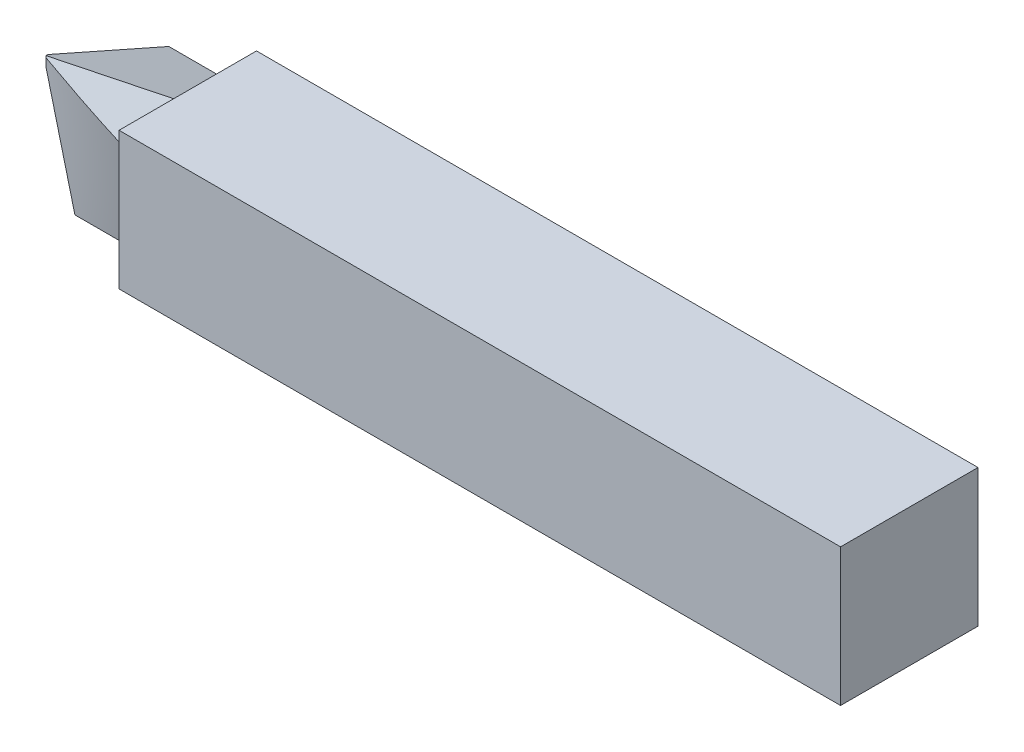
ISO-10303-21;
HEADER;
FILE_DESCRIPTION(('STEP AP214'),'2;1');
FILE_NAME('part.step','',(''),(''),'','','');
FILE_SCHEMA(('AUTOMOTIVE_DESIGN { 1 0 10303 214 1 1 1 1 }'));
ENDSEC;
DATA;
#1=APPLICATION_CONTEXT('core data for automotive mechanical design processes');
#2=APPLICATION_PROTOCOL_DEFINITION('international standard','automotive_design',2000,#1);
#3=PRODUCT_CONTEXT('',#1,'mechanical');
#4=PRODUCT('Part','Part','',(#3));
#5=PRODUCT_RELATED_PRODUCT_CATEGORY('part','',(#4));
#6=PRODUCT_DEFINITION_FORMATION('','',#4);
#7=PRODUCT_DEFINITION_CONTEXT('part definition',#1,'design');
#8=PRODUCT_DEFINITION('design','',#6,#7);
#9=PRODUCT_DEFINITION_SHAPE('','',#8);
#10=(LENGTH_UNIT() NAMED_UNIT(*) SI_UNIT(.MILLI.,.METRE.));
#11=(NAMED_UNIT(*) PLANE_ANGLE_UNIT() SI_UNIT($,.RADIAN.));
#12=(NAMED_UNIT(*) SI_UNIT($,.STERADIAN.) SOLID_ANGLE_UNIT());
#13=UNCERTAINTY_MEASURE_WITH_UNIT(LENGTH_MEASURE(1.E-05),#10,'distance_accuracy_value','');
#14=(GEOMETRIC_REPRESENTATION_CONTEXT(3) GLOBAL_UNCERTAINTY_ASSIGNED_CONTEXT((#13)) GLOBAL_UNIT_ASSIGNED_CONTEXT((#10,
#11,#12)) REPRESENTATION_CONTEXT('',''));
#15=CARTESIAN_POINT('',(0.,0.,0.));
#16=DIRECTION('',(0.,0.,1.));
#17=DIRECTION('',(1.,0.,0.));
#18=AXIS2_PLACEMENT_3D('',#15,#16,#17);
#19=CARTESIAN_POINT('',(15.,10.,10.));
#20=CARTESIAN_POINT('',(15.,-10.,3.87867740821987));
#21=CARTESIAN_POINT('',(12.5,10.,9.3301270189222));
#22=CARTESIAN_POINT('',(12.9092818696764,-10.,3.87867740821987));
#23=CARTESIAN_POINT('',(10.,10.,8.66025403784439));
#24=CARTESIAN_POINT('',(10.8185637393527,-10.,3.87867740821987));
#25=CARTESIAN_POINT('',(5.,10.,7.32050807568877));
#26=CARTESIAN_POINT('',(6.63712747870541,-10.,3.87867740821987));
#27=CARTESIAN_POINT('',(2.5,10.,6.65063509461096));
#28=CARTESIAN_POINT('',(4.54640934838176,-10.,3.87867740821987));
#29=CARTESIAN_POINT('',(0.,10.,5.98076211353315));
#30=CARTESIAN_POINT('',(2.45569121805811,-10.,3.87867740821987));
#31=(BOUNDED_SURFACE() B_SPLINE_SURFACE(3,1,((#19,#20),(#21,#22),(#23,#24),(#25,#26),(#27,#28),
(#29,#30)),.UNSPECIFIED.,.F.,.F.,.F.) B_SPLINE_SURFACE_WITH_KNOTS((4,2,4),(2,2),(0.,0.5,1.),(0.,
1.),.UNSPECIFIED.) GEOMETRIC_REPRESENTATION_ITEM() RATIONAL_B_SPLINE_SURFACE(((1.,1.),(1.,1.),
(1.,1.),(1.,1.),(1.,1.),(1.,1.))) REPRESENTATION_ITEM('') SURFACE());
#32=CARTESIAN_POINT('',(0.546298910514148,9.90367276254304,6.11327160630295));
#33=CARTESIAN_POINT('',(0.540506221738827,9.89520023405755,6.11050677704795));
#34=CARTESIAN_POINT('',(0.534977257830135,9.88654060330857,6.10778735300682));
#35=CARTESIAN_POINT('',(0.523969618314375,9.86825513874478,6.1022269158562));
#36=CARTESIAN_POINT('',(0.518526539916392,9.85860582885153,6.09939231698987));
#37=CARTESIAN_POINT('',(0.507689279109137,9.83834384015307,6.09360224445215));
#38=CARTESIAN_POINT('',(0.502327588833297,9.82771221259882,6.09065302352847));
#39=CARTESIAN_POINT('',(0.491657617956346,9.80547970552115,6.08463475210115));
#40=CARTESIAN_POINT('',(0.48637916802469,9.79386295728239,6.08157169904691));
#41=CARTESIAN_POINT('',(0.475878210634145,9.76965787623292,6.07532680193742));
#42=CARTESIAN_POINT('',(0.470682855824234,9.75705637329503,6.07215063809136));
#43=CARTESIAN_POINT('',(0.460352048995231,9.73087896891195,6.06568088071538));
#44=CARTESIAN_POINT('',(0.455241373776108,9.71729202645838,6.06239264702499));
#45=CARTESIAN_POINT('',(0.439547346996423,9.67381904284576,6.05205539433316));
#46=CARTESIAN_POINT('',(0.429637317166674,9.64365436704081,6.04515627691639));
#47=CARTESIAN_POINT('',(0.410001681387792,9.57944572745864,6.03088353945157));
#48=CARTESIAN_POINT('',(0.400424405391126,9.54534972967789,6.02354482040574));
#49=CARTESIAN_POINT('',(0.381485915403176,9.47325698648098,6.00840418134935));
#50=CARTESIAN_POINT('',(0.372249411332458,9.43522140457306,6.00063281579612));
#51=CARTESIAN_POINT('',(0.354017684491827,9.35523885561779,5.98463814008822));
#52=CARTESIAN_POINT('',(0.345128218982267,9.31326270954695,5.97644176306692));
#53=CARTESIAN_POINT('',(0.327610086635228,9.22539082503619,5.95960730079471));
#54=CARTESIAN_POINT('',(0.319071858244164,9.17947267103265,5.95099307856208));
#55=CARTESIAN_POINT('',(0.300561181596276,9.07389420204966,5.93152513586861));
#56=CARTESIAN_POINT('',(0.290905139339313,9.01416288155193,5.92075762622618));
#57=CARTESIAN_POINT('',(0.272106082252559,8.8895583591584,5.89870945961649));
#58=CARTESIAN_POINT('',(0.263069534579339,8.82466398606295,5.88745880995129));
#59=CARTESIAN_POINT('',(0.245524808490058,8.68972902338264,5.86445711274811));
#60=CARTESIAN_POINT('',(0.237108920326707,8.61967200019927,5.85273297998857));
#61=CARTESIAN_POINT('',(0.220841210529613,8.47440250212496,5.82880207806137));
#62=CARTESIAN_POINT('',(0.213071686717167,8.39917667023158,5.81662002525124));
#63=CARTESIAN_POINT('',(0.205801296673084,8.32388294456804,5.80459511220624));
#64=B_SPLINE_CURVE_WITH_KNOTS('',3,(#32,#33,#34,#35,#36,#37,#38,#39,#40,#41,#42,#43,#44,#45,#46,
#47,#48,#49,#50,#51,#52,#53,#54,#55,#56,#57,#58,#59,#60,#61,#62,#63),.UNSPECIFIED.,.F.,.F.,(4,2,
2,2,2,2,2,2,2,2,2,2,2,2,2,4),(0.,0.0318737869042198,0.0661642496335966,0.102954522325853,
0.142311852305628,0.184291106240641,0.228937442523981,0.326367758033971,0.434845776363802,
0.554539092720379,0.685571822061818,0.828038035653471,1.01239155374652,1.21181555159331,
1.42638938563942,1.65617655745565),.UNSPECIFIED.);
#65=CARTESIAN_POINT('',(0.205801296673087,8.32388294456803,5.80459511220634));
#66=VERTEX_POINT('',#65);
#67=CARTESIAN_POINT('',(0.546298910514158,9.90367276254304,6.11327160630295));
#68=VERTEX_POINT('',#67);
#69=EDGE_CURVE('E126',#66,#68,#64,.F.);
#70=DIRECTION('',(0.121211565739221,-0.98718898245743,-0.103757743063883));
#71=VECTOR('',#70,1.);
#72=CARTESIAN_POINT('',(2.65523533984181,-11.6251564554725,3.70786658178036));
#73=LINE('',#72,#71);
#74=CARTESIAN_POINT('',(2.45569121805811,-10.,3.87867740821986));
#75=VERTEX_POINT('',#74);
#76=EDGE_CURVE('E171',#66,#75,#73,.T.);
#77=DIRECTION('',(-1.,0.,0.));
#78=VECTOR('',#77,1.);
#79=CARTESIAN_POINT('',(120.,-10.,3.87867740821987));
#80=LINE('',#79,#78);
#81=CARTESIAN_POINT('',(15.,-10.,3.87867740821987));
#82=VERTEX_POINT('',#81);
#83=EDGE_CURVE('E173',#82,#75,#80,.T.);
#84=DIRECTION('',(0.,-0.956215027462806,-0.292665032510387));
#85=VECTOR('',#84,1.);
#86=CARTESIAN_POINT('',(15.,10.,10.));
#87=LINE('',#86,#85);
#88=CARTESIAN_POINT('',(15.,7.35509528937314,9.19048425208671));
#89=VERTEX_POINT('',#88);
#90=EDGE_CURVE('E10',#89,#82,#87,.T.);
#91=CARTESIAN_POINT('',(0.546298910514158,9.90367276254304,6.11327160630295));
#92=CARTESIAN_POINT('',(5.33603524302105,9.05911301664418,7.26999784262565));
#93=CARTESIAN_POINT('',(10.1551565179942,8.20937191256027,8.30052595856325));
#94=CARTESIAN_POINT('',(15.,7.35509528937314,9.19048425208671));
#95=(BOUNDED_CURVE() B_SPLINE_CURVE(3,(#91,#92,#93,#94),.UNSPECIFIED.,.F.,
.F.) B_SPLINE_CURVE_WITH_KNOTS((4,4),(0.000570287711359436,0.0155671268516791),
.UNSPECIFIED.) CURVE() GEOMETRIC_REPRESENTATION_ITEM() RATIONAL_B_SPLINE_CURVE((1.,1.,1.,1.)) REPRESENTATION_ITEM(''));
#96=EDGE_CURVE('E143',#68,#89,#95,.T.);
#97=ORIENTED_EDGE('',*,*,#69,.F.);
#98=ORIENTED_EDGE('',*,*,#76,.T.);
#99=ORIENTED_EDGE('',*,*,#83,.F.);
#100=ORIENTED_EDGE('',*,*,#90,.F.);
#101=ORIENTED_EDGE('',*,*,#96,.F.);
#102=EDGE_LOOP('',(#97,#98,#99,#100,#101));
#103=FACE_BOUND('',#102,.T.);
#104=ADVANCED_FACE('F16',(#103),#31,.T.);
#105=CARTESIAN_POINT('',(15.,6.90804232406403,-2.51432178301037));
#106=DIRECTION('',(0.,-0.939692620785911,0.342020143325663));
#107=DIRECTION('',(-1.,0.,0.));
#108=AXIS2_PLACEMENT_3D('',#105,#106,#107);
#109=PLANE('',#108);
#110=CARTESIAN_POINT('',(0.0985039668527643,9.74489612241542,5.27986997025431));
#111=CARTESIAN_POINT('',(0.069217770176215,9.82074101039906,5.48825208737043));
#112=CARTESIAN_POINT('',(0.120283898787417,9.89504180394619,5.69239183988873));
#113=CARTESIAN_POINT('',(0.244235743587721,9.95693464875209,5.86244103341864));
#114=(BOUNDED_CURVE() B_SPLINE_CURVE(3,(#110,#111,#112,#113),.UNSPECIFIED.,.F.,
.F.) B_SPLINE_CURVE_WITH_KNOTS((4,4),(4.57276264022514,5.34226024087535),
.UNSPECIFIED.) CURVE() GEOMETRIC_REPRESENTATION_ITEM() RATIONAL_B_SPLINE_CURVE((1.,
0.95126182917611,0.95126182917611,1.)) REPRESENTATION_ITEM(''));
#115=CARTESIAN_POINT('',(0.0985039668527643,9.74489612241542,5.27986997025431));
#116=VERTEX_POINT('',#115);
#117=CARTESIAN_POINT('',(0.244235743587721,9.95693464875209,5.86244103341864));
#118=VERTEX_POINT('',#117);
#119=EDGE_CURVE('E138',#116,#118,#114,.T.);
#120=ORIENTED_EDGE('',*,*,#119,.T.);
#121=DIRECTION('',(0.888831911434334,-0.156725047300544,-0.430598528521209));
#122=VECTOR('',#121,1.);
#123=CARTESIAN_POINT('',(9.04025358617476,8.405959380311,1.60117150524408));
#124=LINE('',#123,#122);
#125=CARTESIAN_POINT('',(15.,7.35509528937314,-1.28605385552347));
#126=VERTEX_POINT('',#125);
#127=EDGE_CURVE('E155',#118,#126,#124,.T.);
#128=ORIENTED_EDGE('',*,*,#127,.T.);
#129=DIRECTION('',(0.,-0.342020143325663,-0.939692620785911));
#130=VECTOR('',#129,1.);
#131=CARTESIAN_POINT('',(15.,4.183478269785,-10.));
#132=LINE('',#131,#130);
#133=CARTESIAN_POINT('',(15.,4.183478269785,-10.));
#134=VERTEX_POINT('',#133);
#135=EDGE_CURVE('E29',#126,#134,#132,.T.);
#136=ORIENTED_EDGE('',*,*,#135,.T.);
#137=DIRECTION('',(-1.,0.,0.));
#138=VECTOR('',#137,1.);
#139=CARTESIAN_POINT('',(15.,4.18347826978496,-10.));
#140=LINE('',#139,#138);
#141=CARTESIAN_POINT('',(2.2459496466162,4.18347826978497,-10.));
#142=VERTEX_POINT('',#141);
#143=EDGE_CURVE('E260',#134,#142,#140,.T.);
#144=ORIENTED_EDGE('',*,*,#143,.T.);
#145=DIRECTION('',(-0.130928346226655,0.339075977093174,0.931603590543028));
#146=VECTOR('',#145,1.);
#147=CARTESIAN_POINT('',(6.05685222697823,-5.68593162718414,-37.1159808352652));
#148=LINE('',#147,#146);
#149=EDGE_CURVE('E306',#142,#116,#148,.T.);
#150=ORIENTED_EDGE('',*,*,#149,.T.);
#151=EDGE_LOOP('',(#120,#128,#136,#144,#150));
#152=FACE_BOUND('',#151,.T.);
#153=ADVANCED_FACE('F200',(#152),#109,.F.);
#154=CARTESIAN_POINT('',(15.,0.,-110.));
#155=DIRECTION('',(-1.,0.,0.));
#156=DIRECTION('',(0.,0.,1.));
#157=AXIS2_PLACEMENT_3D('',#154,#155,#156);
#158=PLANE('',#157);
#159=DIRECTION('',(0.,-1.,0.));
#160=VECTOR('',#159,1.);
#161=CARTESIAN_POINT('',(15.,-10.,-10.));
#162=LINE('',#161,#160);
#163=CARTESIAN_POINT('',(15.,10.,-10.));
#164=VERTEX_POINT('',#163);
#165=EDGE_CURVE('E255',#164,#134,#162,.T.);
#166=ORIENTED_EDGE('',*,*,#165,.T.);
#167=ORIENTED_EDGE('',*,*,#135,.F.);
#168=DIRECTION('',(0.,0.,1.));
#169=VECTOR('',#168,1.);
#170=CARTESIAN_POINT('',(15.,7.35509528937314,-14.));
#171=LINE('',#170,#169);
#172=EDGE_CURVE('E146',#126,#89,#171,.T.);
#173=ORIENTED_EDGE('',*,*,#172,.T.);
#174=ORIENTED_EDGE('',*,*,#90,.T.);
#175=DIRECTION('',(0.,0.,-1.));
#176=VECTOR('',#175,1.);
#177=CARTESIAN_POINT('',(15.,-10.,5.98076211353327));
#178=LINE('',#177,#176);
#179=CARTESIAN_POINT('',(15.,-10.,10.));
#180=VERTEX_POINT('',#179);
#181=EDGE_CURVE('E273',#180,#82,#178,.T.);
#182=ORIENTED_EDGE('',*,*,#181,.F.);
#183=DIRECTION('',(0.,1.,0.));
#184=VECTOR('',#183,1.);
#185=CARTESIAN_POINT('',(15.,-110.,10.));
#186=LINE('',#185,#184);
#187=CARTESIAN_POINT('',(15.,10.,10.));
#188=VERTEX_POINT('',#187);
#189=EDGE_CURVE('E307',#180,#188,#186,.T.);
#190=ORIENTED_EDGE('',*,*,#189,.T.);
#191=DIRECTION('',(0.,0.,1.));
#192=VECTOR('',#191,1.);
#193=CARTESIAN_POINT('',(15.,10.,-14.));
#194=LINE('',#193,#192);
#195=EDGE_CURVE('E55',#164,#188,#194,.T.);
#196=ORIENTED_EDGE('',*,*,#195,.F.);
#197=EDGE_LOOP('',(#166,#167,#173,#174,#182,#190,#196));
#198=FACE_BOUND('',#197,.T.);
#199=ADVANCED_FACE('F18',(#198),#158,.T.);
#200=CARTESIAN_POINT('',(120.,0.,0.));
#201=DIRECTION('',(-1.,0.,0.));
#202=DIRECTION('',(0.,0.,1.));
#203=AXIS2_PLACEMENT_3D('',#200,#201,#202);
#204=PLANE('',#203);
#205=DIRECTION('',(0.,1.,0.));
#206=VECTOR('',#205,1.);
#207=CARTESIAN_POINT('',(120.,-10.,-10.));
#208=LINE('',#207,#206);
#209=CARTESIAN_POINT('',(120.,-10.,-10.));
#210=VERTEX_POINT('',#209);
#211=CARTESIAN_POINT('',(120.,10.,-10.));
#212=VERTEX_POINT('',#211);
#213=EDGE_CURVE('E249',#210,#212,#208,.T.);
#214=ORIENTED_EDGE('',*,*,#213,.T.);
#215=DIRECTION('',(0.,0.,1.));
#216=VECTOR('',#215,1.);
#217=CARTESIAN_POINT('',(120.,10.,10.));
#218=LINE('',#217,#216);
#219=CARTESIAN_POINT('',(120.,10.,10.));
#220=VERTEX_POINT('',#219);
#221=EDGE_CURVE('E45',#212,#220,#218,.T.);
#222=ORIENTED_EDGE('',*,*,#221,.T.);
#223=DIRECTION('',(0.,-1.,0.));
#224=VECTOR('',#223,1.);
#225=CARTESIAN_POINT('',(120.,-10.,10.));
#226=LINE('',#225,#224);
#227=CARTESIAN_POINT('',(120.,-10.,10.));
#228=VERTEX_POINT('',#227);
#229=EDGE_CURVE('E313',#220,#228,#226,.T.);
#230=ORIENTED_EDGE('',*,*,#229,.T.);
#231=DIRECTION('',(0.,0.,-1.));
#232=VECTOR('',#231,1.);
#233=CARTESIAN_POINT('',(120.,-10.,10.));
#234=LINE('',#233,#232);
#235=EDGE_CURVE('E286',#228,#210,#234,.T.);
#236=ORIENTED_EDGE('',*,*,#235,.T.);
#237=EDGE_LOOP('',(#214,#222,#230,#236));
#238=FACE_BOUND('',#237,.T.);
#239=ADVANCED_FACE('F217',(#238),#204,.F.);
#240=CARTESIAN_POINT('',(120.,10.,10.));
#241=DIRECTION('',(0.,-1.,0.));
#242=DIRECTION('',(0.,0.,-1.));
#243=AXIS2_PLACEMENT_3D('',#240,#241,#242);
#244=PLANE('',#243);
#245=DIRECTION('',(-1.,0.,0.));
#246=VECTOR('',#245,1.);
#247=CARTESIAN_POINT('',(120.,10.,-10.));
#248=LINE('',#247,#246);
#249=EDGE_CURVE('E246',#212,#164,#248,.T.);
#250=ORIENTED_EDGE('',*,*,#249,.T.);
#251=ORIENTED_EDGE('',*,*,#195,.T.);
#252=DIRECTION('',(-1.,0.,0.));
#253=VECTOR('',#252,1.);
#254=CARTESIAN_POINT('',(120.,10.,10.));
#255=LINE('',#254,#253);
#256=EDGE_CURVE('E317',#220,#188,#255,.T.);
#257=ORIENTED_EDGE('',*,*,#256,.F.);
#258=ORIENTED_EDGE('',*,*,#221,.F.);
#259=EDGE_LOOP('',(#250,#251,#257,#258));
#260=FACE_BOUND('',#259,.T.);
#261=ADVANCED_FACE('F223',(#260),#244,.F.);
#262=CARTESIAN_POINT('',(120.,-10.,10.));
#263=DIRECTION('',(0.,0.,-1.));
#264=DIRECTION('',(0.,-1.,0.));
#265=AXIS2_PLACEMENT_3D('',#262,#263,#264);
#266=PLANE('',#265);
#267=ORIENTED_EDGE('',*,*,#189,.F.);
#268=DIRECTION('',(-1.,0.,0.));
#269=VECTOR('',#268,1.);
#270=CARTESIAN_POINT('',(120.,-10.,10.));
#271=LINE('',#270,#269);
#272=EDGE_CURVE('E287',#228,#180,#271,.T.);
#273=ORIENTED_EDGE('',*,*,#272,.F.);
#274=ORIENTED_EDGE('',*,*,#229,.F.);
#275=ORIENTED_EDGE('',*,*,#256,.T.);
#276=EDGE_LOOP('',(#267,#273,#274,#275));
#277=FACE_BOUND('',#276,.T.);
#278=ADVANCED_FACE('F240',(#277),#266,.F.);
#279=CARTESIAN_POINT('',(0.824260727372357,-110.,0.115842290637306));
#280=DIRECTION('',(-0.990268068741571,0.,-0.139173100960058));
#281=DIRECTION('',(-0.139173100960058,0.,0.990268068741571));
#282=AXIS2_PLACEMENT_3D('',#279,#280,#281);
#283=PLANE('',#282);
#284=DIRECTION('',(0.0920735116700315,-0.749878575880894,-0.655137077170565));
#285=VECTOR('',#284,1.);
#286=CARTESIAN_POINT('',(8.6460386406689,-60.4163339192617,-55.5389994488492));
#287=LINE('',#286,#285);
#288=CARTESIAN_POINT('',(0.0985039668527643,9.19774956942134,5.27986997025431));
#289=VERTEX_POINT('',#288);
#290=CARTESIAN_POINT('',(2.2459496466162,-8.29179198182939,-10.));
#291=VERTEX_POINT('',#290);
#292=EDGE_CURVE('E141',#289,#291,#287,.T.);
#293=ORIENTED_EDGE('',*,*,#292,.F.);
#294=DIRECTION('',(0.,1.,0.));
#295=VECTOR('',#294,1.);
#296=CARTESIAN_POINT('',(0.0985039668527643,-18.,5.27986997025431));
#297=LINE('',#296,#295);
#298=EDGE_CURVE('E296',#289,#116,#297,.T.);
#299=ORIENTED_EDGE('',*,*,#298,.T.);
#300=ORIENTED_EDGE('',*,*,#149,.F.);
#301=DIRECTION('',(0.,1.,0.));
#302=VECTOR('',#301,1.);
#303=CARTESIAN_POINT('',(2.2459496466162,-110.,-10.));
#304=LINE('',#303,#302);
#305=EDGE_CURVE('E279',#291,#142,#304,.T.);
#306=ORIENTED_EDGE('',*,*,#305,.F.);
#307=EDGE_LOOP('',(#293,#299,#300,#306));
#308=FACE_BOUND('',#307,.T.);
#309=ADVANCED_FACE('F230',(#308),#283,.T.);
#310=CARTESIAN_POINT('',(0.890718421846022,-18.,5.39120845102237));
#311=DIRECTION('',(0.,1.,0.));
#312=DIRECTION('',(0.,0.,1.));
#313=AXIS2_PLACEMENT_3D('',#310,#311,#312);
#314=CYLINDRICAL_SURFACE('',#313,0.8);
#315=CARTESIAN_POINT('',(0.205801296673087,8.32388294456803,5.80459511220634));
#316=CARTESIAN_POINT('',(0.109860249697065,9.10526006780331,5.64563578368643));
#317=CARTESIAN_POINT('',(0.0726639206765967,9.40819985719492,5.46373145244124));
#318=CARTESIAN_POINT('',(0.0985039668527643,9.19774956942134,5.27986997025431));
#319=(BOUNDED_CURVE() B_SPLINE_CURVE(3,(#315,#316,#317,#318),.UNSPECIFIED.,.F.,
.F.) B_SPLINE_CURVE_WITH_KNOTS((4,4),(5.74015432415557,6.42281164733913),
.UNSPECIFIED.) CURVE() GEOMETRIC_REPRESENTATION_ITEM() RATIONAL_B_SPLINE_CURVE((1.,
0.961540494684085,0.961540494684085,1.)) REPRESENTATION_ITEM(''));
#320=EDGE_CURVE('E134',#66,#289,#319,.T.);
#321=ORIENTED_EDGE('',*,*,#320,.F.);
#322=ORIENTED_EDGE('',*,*,#69,.T.);
#323=CARTESIAN_POINT('',(0.244235743587721,9.95693464875209,5.86244103341864));
#324=CARTESIAN_POINT('',(0.322931544541853,9.94305845577541,5.970403585392));
#325=CARTESIAN_POINT('',(0.42571442534292,9.92493506073524,6.05575357737));
#326=CARTESIAN_POINT('',(0.546298910514158,9.90367276254304,6.11327160630295));
#327=(BOUNDED_CURVE() B_SPLINE_CURVE(3,(#323,#324,#325,#326),.UNSPECIFIED.,.F.,
.F.) B_SPLINE_CURVE_WITH_KNOTS((4,4),(0.62987126049076,1.12572264050371),
.UNSPECIFIED.) CURVE() GEOMETRIC_REPRESENTATION_ITEM() RATIONAL_B_SPLINE_CURVE((1.,
0.979615686232492,0.979615686232492,1.)) REPRESENTATION_ITEM(''));
#328=EDGE_CURVE('E131',#118,#68,#327,.T.);
#329=ORIENTED_EDGE('',*,*,#328,.F.);
#330=ORIENTED_EDGE('',*,*,#119,.F.);
#331=ORIENTED_EDGE('',*,*,#298,.F.);
#332=EDGE_LOOP('',(#321,#322,#329,#330,#331));
#333=FACE_BOUND('',#332,.T.);
#334=ADVANCED_FACE('F127',(#333),#314,.T.);
#335=CARTESIAN_POINT('',(1.20960947799834,0.148521368620019,-110.));
#336=DIRECTION('',(0.992546151641322,0.121869343405148,0.));
#337=DIRECTION('',(0.,0.,-1.));
#338=AXIS2_PLACEMENT_3D('',#335,#336,#337);
#339=PLANE('',#338);
#340=ORIENTED_EDGE('',*,*,#76,.F.);
#341=ORIENTED_EDGE('',*,*,#320,.T.);
#342=ORIENTED_EDGE('',*,*,#292,.T.);
#343=DIRECTION('',(-0.121869343405148,0.992546151641322,0.));
#344=VECTOR('',#343,1.);
#345=CARTESIAN_POINT('',(4.20147537943691,-24.2182709987401,-10.));
#346=LINE('',#345,#344);
#347=CARTESIAN_POINT('',(2.4556912180581,-10.,-10.));
#348=VERTEX_POINT('',#347);
#349=EDGE_CURVE('E274',#348,#291,#346,.T.);
#350=ORIENTED_EDGE('',*,*,#349,.F.);
#351=DIRECTION('',(0.,0.,1.));
#352=VECTOR('',#351,1.);
#353=CARTESIAN_POINT('',(2.4556912180581,-10.,-110.));
#354=LINE('',#353,#352);
#355=EDGE_CURVE('E285',#348,#75,#354,.T.);
#356=ORIENTED_EDGE('',*,*,#355,.T.);
#357=EDGE_LOOP('',(#340,#341,#342,#350,#356));
#358=FACE_BOUND('',#357,.T.);
#359=ADVANCED_FACE('F214',(#358),#339,.F.);
#360=CARTESIAN_POINT('',(120.,-10.,10.));
#361=DIRECTION('',(0.,1.,0.));
#362=DIRECTION('',(1.,0.,0.));
#363=AXIS2_PLACEMENT_3D('',#360,#361,#362);
#364=PLANE('',#363);
#365=ORIENTED_EDGE('',*,*,#355,.F.);
#366=DIRECTION('',(-1.,0.,0.));
#367=VECTOR('',#366,1.);
#368=CARTESIAN_POINT('',(120.,-10.,-10.));
#369=LINE('',#368,#367);
#370=EDGE_CURVE('E275',#210,#348,#369,.T.);
#371=ORIENTED_EDGE('',*,*,#370,.F.);
#372=ORIENTED_EDGE('',*,*,#235,.F.);
#373=ORIENTED_EDGE('',*,*,#272,.T.);
#374=ORIENTED_EDGE('',*,*,#181,.T.);
#375=ORIENTED_EDGE('',*,*,#83,.T.);
#376=EDGE_LOOP('',(#365,#371,#372,#373,#374,#375));
#377=FACE_BOUND('',#376,.T.);
#378=ADVANCED_FACE('F207',(#377),#364,.F.);
#379=CARTESIAN_POINT('',(120.,-10.,-10.));
#380=DIRECTION('',(0.,0.,1.));
#381=DIRECTION('',(1.,0.,0.));
#382=AXIS2_PLACEMENT_3D('',#379,#380,#381);
#383=PLANE('',#382);
#384=ORIENTED_EDGE('',*,*,#143,.F.);
#385=ORIENTED_EDGE('',*,*,#165,.F.);
#386=ORIENTED_EDGE('',*,*,#249,.F.);
#387=ORIENTED_EDGE('',*,*,#213,.F.);
#388=ORIENTED_EDGE('',*,*,#370,.T.);
#389=ORIENTED_EDGE('',*,*,#349,.T.);
#390=ORIENTED_EDGE('',*,*,#305,.T.);
#391=EDGE_LOOP('',(#384,#385,#386,#387,#388,#389,#390));
#392=FACE_BOUND('',#391,.T.);
#393=ADVANCED_FACE('F204',(#392),#383,.F.);
#394=CARTESIAN_POINT('',(1.71010071662827,9.69846310392956,-14.));
#395=DIRECTION('',(-0.173648177666924,-0.984807753012209,0.));
#396=DIRECTION('',(-0.984807753012209,0.173648177666924,0.));
#397=AXIS2_PLACEMENT_3D('',#394,#395,#396);
#398=PLANE('',#397);
#399=ORIENTED_EDGE('',*,*,#127,.F.);
#400=ORIENTED_EDGE('',*,*,#328,.T.);
#401=ORIENTED_EDGE('',*,*,#96,.T.);
#402=ORIENTED_EDGE('',*,*,#172,.F.);
#403=EDGE_LOOP('',(#399,#400,#401,#402));
#404=FACE_BOUND('',#403,.T.);
#405=ADVANCED_FACE('F152',(#404),#398,.F.);
#406=CLOSED_SHELL('',(#104,#153,#199,#239,#261,#278,#309,#334,#359,#378,#393,#405));
#407=MANIFOLD_SOLID_BREP('B1',#406);
#408=ADVANCED_BREP_SHAPE_REPRESENTATION('',(#18,#407),#14);
#409=SHAPE_DEFINITION_REPRESENTATION(#9,#408);
ENDSEC;
END-ISO-10303-21;
